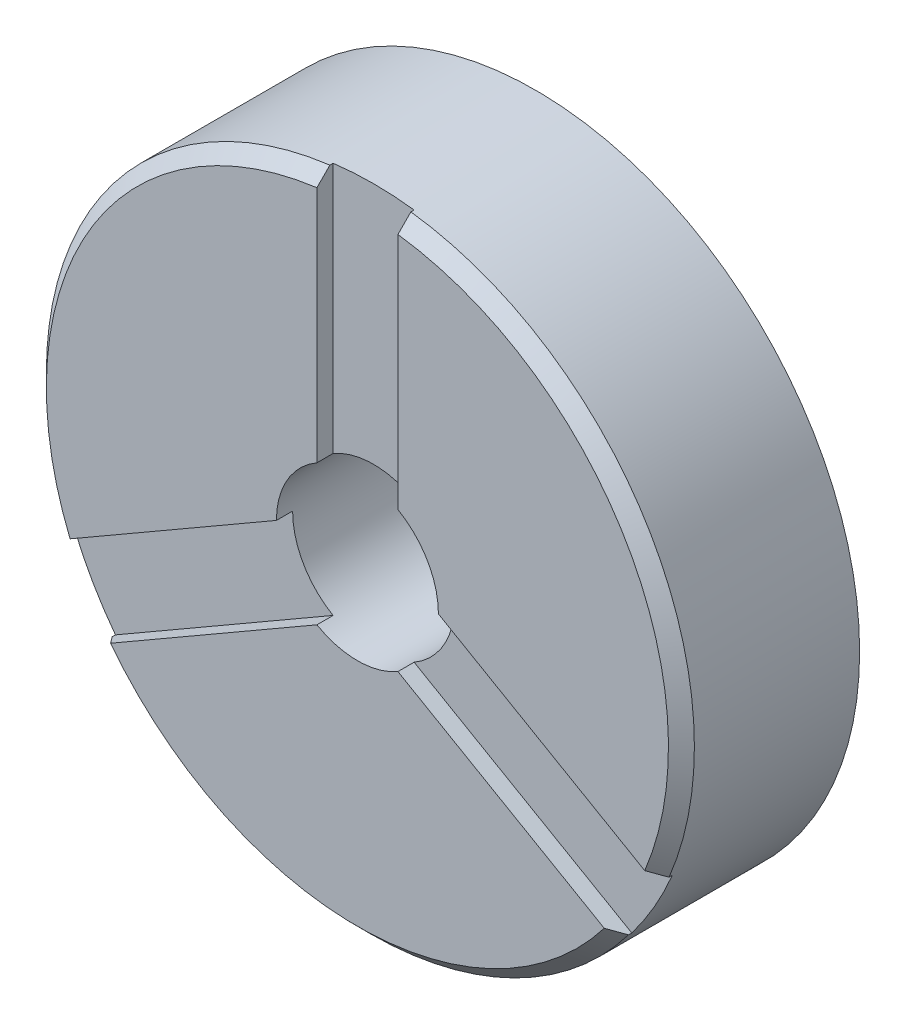
ISO-10303-21;
HEADER;
FILE_DESCRIPTION(('STEP AP214'),'2;1');
FILE_NAME('part.step','',(''),(''),'','','');
FILE_SCHEMA(('AUTOMOTIVE_DESIGN { 1 0 10303 214 1 1 1 1 }'));
ENDSEC;
DATA;
#1=APPLICATION_CONTEXT('core data for automotive mechanical design processes');
#2=APPLICATION_PROTOCOL_DEFINITION('international standard','automotive_design',2000,#1);
#3=PRODUCT_CONTEXT('',#1,'mechanical');
#4=PRODUCT('Part','Part','',(#3));
#5=PRODUCT_RELATED_PRODUCT_CATEGORY('part','',(#4));
#6=PRODUCT_DEFINITION_FORMATION('','',#4);
#7=PRODUCT_DEFINITION_CONTEXT('part definition',#1,'design');
#8=PRODUCT_DEFINITION('design','',#6,#7);
#9=PRODUCT_DEFINITION_SHAPE('','',#8);
#10=(LENGTH_UNIT() NAMED_UNIT(*) SI_UNIT(.MILLI.,.METRE.));
#11=(NAMED_UNIT(*) PLANE_ANGLE_UNIT() SI_UNIT($,.RADIAN.));
#12=(NAMED_UNIT(*) SI_UNIT($,.STERADIAN.) SOLID_ANGLE_UNIT());
#13=UNCERTAINTY_MEASURE_WITH_UNIT(LENGTH_MEASURE(1.E-05),#10,'distance_accuracy_value','');
#14=(GEOMETRIC_REPRESENTATION_CONTEXT(3) GLOBAL_UNCERTAINTY_ASSIGNED_CONTEXT((#13)) GLOBAL_UNIT_ASSIGNED_CONTEXT((#10,
#11,#12)) REPRESENTATION_CONTEXT('',''));
#15=CARTESIAN_POINT('',(0.,0.,0.));
#16=DIRECTION('',(0.,0.,1.));
#17=DIRECTION('',(1.,0.,0.));
#18=AXIS2_PLACEMENT_3D('',#15,#16,#17);
#19=CARTESIAN_POINT('',(0.,0.,0.));
#20=DIRECTION('',(0.,0.,-1.));
#21=DIRECTION('',(0.5,0.866025403784438,0.));
#22=AXIS2_PLACEMENT_3D('',#19,#20,#21);
#23=PLANE('',#22);
#24=DIRECTION('',(0.,-1.,0.));
#25=VECTOR('',#24,1.);
#26=CARTESIAN_POINT('',(-25.,198.431348329844,0.));
#27=LINE('',#26,#25);
#28=CARTESIAN_POINT('',(-25.,198.431348329844,0.));
#29=VERTEX_POINT('',#28);
#30=CARTESIAN_POINT('',(-25.,43.3012701892219,0.));
#31=VERTEX_POINT('',#30);
#32=EDGE_CURVE('E173',#29,#31,#27,.T.);
#33=ORIENTED_EDGE('',*,*,#32,.T.);
#34=CARTESIAN_POINT('',(0.,0.,0.));
#35=DIRECTION('',(0.,0.,1.));
#36=DIRECTION('',(1.,0.,0.));
#37=AXIS2_PLACEMENT_3D('',#34,#35,#36);
#38=CIRCLE('',#37,50.);
#39=CARTESIAN_POINT('',(25.,43.3012701892219,0.));
#40=VERTEX_POINT('',#39);
#41=EDGE_CURVE('E166',#40,#31,#38,.T.);
#42=ORIENTED_EDGE('',*,*,#41,.F.);
#43=DIRECTION('',(0.,1.,0.));
#44=VECTOR('',#43,1.);
#45=CARTESIAN_POINT('',(25.,43.3012701892219,0.));
#46=LINE('',#45,#44);
#47=CARTESIAN_POINT('',(25.,198.431348329844,0.));
#48=VERTEX_POINT('',#47);
#49=EDGE_CURVE('E170',#40,#48,#46,.T.);
#50=ORIENTED_EDGE('',*,*,#49,.T.);
#51=CARTESIAN_POINT('',(0.,0.,0.));
#52=DIRECTION('',(0.,0.,1.));
#53=DIRECTION('',(1.,0.,0.));
#54=AXIS2_PLACEMENT_3D('',#51,#52,#53);
#55=CIRCLE('',#54,200.);
#56=EDGE_CURVE('E198',#48,#29,#55,.T.);
#57=ORIENTED_EDGE('',*,*,#56,.T.);
#58=EDGE_LOOP('',(#33,#42,#50,#57));
#59=FACE_BOUND('',#58,.T.);
#60=ADVANCED_FACE('F17',(#59),#23,.F.);
#61=DIRECTION('',(-0.866025403784438,0.5,0.));
#62=VECTOR('',#61,1.);
#63=CARTESIAN_POINT('',(184.346588560844,-77.5650390703113,0.));
#64=LINE('',#63,#62);
#65=CARTESIAN_POINT('',(184.346588560844,-77.5650390703113,0.));
#66=VERTEX_POINT('',#65);
#67=CARTESIAN_POINT('',(50.,0.,0.));
#68=VERTEX_POINT('',#67);
#69=EDGE_CURVE('E261',#66,#68,#64,.T.);
#70=ORIENTED_EDGE('',*,*,#69,.T.);
#71=CARTESIAN_POINT('',(25.,-43.3012701892219,0.));
#72=VERTEX_POINT('',#71);
#73=EDGE_CURVE('E180',#72,#68,#38,.T.);
#74=ORIENTED_EDGE('',*,*,#73,.F.);
#75=DIRECTION('',(0.866025403784438,-0.5,0.));
#76=VECTOR('',#75,1.);
#77=CARTESIAN_POINT('',(25.,-43.3012701892219,0.));
#78=LINE('',#77,#76);
#79=CARTESIAN_POINT('',(159.346588560844,-120.866309259533,0.));
#80=VERTEX_POINT('',#79);
#81=EDGE_CURVE('E255',#72,#80,#78,.T.);
#82=ORIENTED_EDGE('',*,*,#81,.T.);
#83=CARTESIAN_POINT('',(0.,0.,0.));
#84=DIRECTION('',(0.,0.,1.));
#85=DIRECTION('',(-0.5,-0.866025403784438,0.));
#86=AXIS2_PLACEMENT_3D('',#83,#84,#85);
#87=CIRCLE('',#86,200.);
#88=EDGE_CURVE('E269',#80,#66,#87,.T.);
#89=ORIENTED_EDGE('',*,*,#88,.T.);
#90=EDGE_LOOP('',(#70,#74,#82,#89));
#91=FACE_BOUND('',#90,.T.);
#92=ADVANCED_FACE('F429',(#91),#23,.F.);
#93=CARTESIAN_POINT('',(0.,0.,10.));
#94=DIRECTION('',(0.,0.,1.));
#95=DIRECTION('',(1.,0.,0.));
#96=AXIS2_PLACEMENT_3D('',#93,#94,#95);
#97=PLANE('',#96);
#98=DIRECTION('',(0.866025403784438,-0.5,0.));
#99=VECTOR('',#98,1.);
#100=CARTESIAN_POINT('',(25.,-43.3012701892219,10.));
#101=LINE('',#100,#99);
#102=CARTESIAN_POINT('',(25.,-43.3012701892219,10.));
#103=VERTEX_POINT('',#102);
#104=CARTESIAN_POINT('',(152.361305344826,-116.833354114399,10.));
#105=VERTEX_POINT('',#104);
#106=EDGE_CURVE('E256',#103,#105,#101,.T.);
#107=ORIENTED_EDGE('',*,*,#106,.F.);
#108=CARTESIAN_POINT('',(0.,0.,10.));
#109=DIRECTION('',(0.,0.,1.));
#110=DIRECTION('',(1.,0.,0.));
#111=AXIS2_PLACEMENT_3D('',#108,#109,#110);
#112=CIRCLE('',#111,50.);
#113=CARTESIAN_POINT('',(-25.,-43.3012701892219,10.));
#114=VERTEX_POINT('',#113);
#115=EDGE_CURVE('E206',#114,#103,#112,.T.);
#116=ORIENTED_EDGE('',*,*,#115,.F.);
#117=DIRECTION('',(0.866025403784439,0.5,0.));
#118=VECTOR('',#117,1.);
#119=CARTESIAN_POINT('',(-159.346588560844,-120.866309259533,10.));
#120=LINE('',#119,#118);
#121=CARTESIAN_POINT('',(-152.361305344826,-116.833354114399,10.));
#122=VERTEX_POINT('',#121);
#123=EDGE_CURVE('E226',#122,#114,#120,.T.);
#124=ORIENTED_EDGE('',*,*,#123,.F.);
#125=CARTESIAN_POINT('',(0.,0.,10.));
#126=DIRECTION('',(0.,0.,1.));
#127=DIRECTION('',(1.,0.,0.));
#128=AXIS2_PLACEMENT_3D('',#125,#126,#127);
#129=CIRCLE('',#128,192.);
#130=EDGE_CURVE('E296',#122,#105,#129,.T.);
#131=ORIENTED_EDGE('',*,*,#130,.T.);
#132=EDGE_LOOP('',(#107,#116,#124,#131));
#133=FACE_BOUND('',#132,.T.);
#134=ADVANCED_FACE('F427',(#133),#97,.T.);
#135=DIRECTION('',(-0.866025403784439,-0.5,0.));
#136=VECTOR('',#135,1.);
#137=CARTESIAN_POINT('',(-50.,0.,10.));
#138=LINE('',#137,#136);
#139=CARTESIAN_POINT('',(-50.,0.,10.));
#140=VERTEX_POINT('',#139);
#141=CARTESIAN_POINT('',(-177.361305344826,-73.5320839251774,10.));
#142=VERTEX_POINT('',#141);
#143=EDGE_CURVE('E222',#140,#142,#138,.T.);
#144=ORIENTED_EDGE('',*,*,#143,.F.);
#145=CARTESIAN_POINT('',(-25.,43.3012701892219,10.));
#146=VERTEX_POINT('',#145);
#147=EDGE_CURVE('E204',#146,#140,#112,.T.);
#148=ORIENTED_EDGE('',*,*,#147,.F.);
#149=DIRECTION('',(0.,-1.,0.));
#150=VECTOR('',#149,1.);
#151=CARTESIAN_POINT('',(-25.,198.431348329844,10.));
#152=LINE('',#151,#150);
#153=CARTESIAN_POINT('',(-25.,190.365438039577,10.));
#154=VERTEX_POINT('',#153);
#155=EDGE_CURVE('E208',#154,#146,#152,.T.);
#156=ORIENTED_EDGE('',*,*,#155,.F.);
#157=CARTESIAN_POINT('',(0.,0.,10.));
#158=DIRECTION('',(0.,0.,1.));
#159=DIRECTION('',(1.,0.,0.));
#160=AXIS2_PLACEMENT_3D('',#157,#158,#159);
#161=CIRCLE('',#160,192.);
#162=EDGE_CURVE('E300',#154,#142,#161,.T.);
#163=ORIENTED_EDGE('',*,*,#162,.T.);
#164=EDGE_LOOP('',(#144,#148,#156,#163));
#165=FACE_BOUND('',#164,.T.);
#166=ADVANCED_FACE('F419',(#165),#97,.T.);
#167=DIRECTION('',(0.,1.,0.));
#168=VECTOR('',#167,1.);
#169=CARTESIAN_POINT('',(25.,43.3012701892219,10.));
#170=LINE('',#169,#168);
#171=CARTESIAN_POINT('',(25.,43.3012701892219,10.));
#172=VERTEX_POINT('',#171);
#173=CARTESIAN_POINT('',(25.,190.365438039577,10.));
#174=VERTEX_POINT('',#173);
#175=EDGE_CURVE('E213',#172,#174,#170,.T.);
#176=ORIENTED_EDGE('',*,*,#175,.F.);
#177=CARTESIAN_POINT('',(50.,0.,10.));
#178=VERTEX_POINT('',#177);
#179=EDGE_CURVE('E187',#178,#172,#112,.T.);
#180=ORIENTED_EDGE('',*,*,#179,.F.);
#181=DIRECTION('',(-0.866025403784438,0.5,0.));
#182=VECTOR('',#181,1.);
#183=CARTESIAN_POINT('',(184.346588560844,-77.5650390703113,10.));
#184=LINE('',#183,#182);
#185=CARTESIAN_POINT('',(177.361305344826,-73.5320839251776,10.));
#186=VERTEX_POINT('',#185);
#187=EDGE_CURVE('E260',#186,#178,#184,.T.);
#188=ORIENTED_EDGE('',*,*,#187,.F.);
#189=CARTESIAN_POINT('',(0.,0.,10.));
#190=DIRECTION('',(0.,0.,1.));
#191=DIRECTION('',(1.,0.,0.));
#192=AXIS2_PLACEMENT_3D('',#189,#190,#191);
#193=CIRCLE('',#192,192.);
#194=EDGE_CURVE('E292',#186,#174,#193,.T.);
#195=ORIENTED_EDGE('',*,*,#194,.T.);
#196=EDGE_LOOP('',(#176,#180,#188,#195));
#197=FACE_BOUND('',#196,.T.);
#198=ADVANCED_FACE('F396',(#197),#97,.T.);
#199=CARTESIAN_POINT('',(0.,0.,-100.));
#200=DIRECTION('',(0.,0.,1.));
#201=DIRECTION('',(1.,0.,0.));
#202=AXIS2_PLACEMENT_3D('',#199,#200,#201);
#203=CYLINDRICAL_SURFACE('',#202,200.);
#204=CARTESIAN_POINT('',(0.,0.,-100.));
#205=DIRECTION('',(0.,0.,1.));
#206=DIRECTION('',(1.,0.,0.));
#207=AXIS2_PLACEMENT_3D('',#204,#205,#206);
#208=CIRCLE('',#207,200.);
#209=CARTESIAN_POINT('',(200.,0.,-100.));
#210=VERTEX_POINT('',#209);
#211=EDGE_CURVE('E288',#210,#210,#208,.T.);
#212=ORIENTED_EDGE('',*,*,#211,.T.);
#213=EDGE_LOOP('',(#212));
#214=FACE_BOUND('',#213,.T.);
#215=DIRECTION('',(0.,0.,-1.));
#216=VECTOR('',#215,1.);
#217=CARTESIAN_POINT('',(-184.346588560844,-77.5650390703112,10.));
#218=LINE('',#217,#216);
#219=CARTESIAN_POINT('',(-184.346588560844,-77.5650390703112,2.));
#220=VERTEX_POINT('',#219);
#221=CARTESIAN_POINT('',(-184.346588560844,-77.5650390703112,0.));
#222=VERTEX_POINT('',#221);
#223=EDGE_CURVE('E248',#220,#222,#218,.T.);
#224=ORIENTED_EDGE('',*,*,#223,.F.);
#225=CARTESIAN_POINT('',(0.,0.,2.));
#226=DIRECTION('',(0.,0.,1.));
#227=DIRECTION('',(1.,0.,0.));
#228=AXIS2_PLACEMENT_3D('',#225,#226,#227);
#229=CIRCLE('',#228,200.);
#230=CARTESIAN_POINT('',(-25.,198.431348329844,2.));
#231=VERTEX_POINT('',#230);
#232=EDGE_CURVE('E44',#220,#231,#229,.F.);
#233=ORIENTED_EDGE('',*,*,#232,.T.);
#234=DIRECTION('',(0.,0.,-1.));
#235=VECTOR('',#234,1.);
#236=CARTESIAN_POINT('',(-25.,198.431348329844,10.));
#237=LINE('',#236,#235);
#238=EDGE_CURVE('E217',#231,#29,#237,.T.);
#239=ORIENTED_EDGE('',*,*,#238,.T.);
#240=ORIENTED_EDGE('',*,*,#56,.F.);
#241=DIRECTION('',(0.,0.,-1.));
#242=VECTOR('',#241,1.);
#243=CARTESIAN_POINT('',(25.,198.431348329844,10.));
#244=LINE('',#243,#242);
#245=CARTESIAN_POINT('',(25.,198.431348329844,2.));
#246=VERTEX_POINT('',#245);
#247=EDGE_CURVE('E193',#246,#48,#244,.T.);
#248=ORIENTED_EDGE('',*,*,#247,.F.);
#249=CARTESIAN_POINT('',(0.,0.,2.));
#250=DIRECTION('',(0.,0.,1.));
#251=DIRECTION('',(1.,0.,0.));
#252=AXIS2_PLACEMENT_3D('',#249,#250,#251);
#253=CIRCLE('',#252,200.);
#254=CARTESIAN_POINT('',(184.346588560844,-77.5650390703113,2.00000000000004));
#255=VERTEX_POINT('',#254);
#256=EDGE_CURVE('E313',#246,#255,#253,.F.);
#257=ORIENTED_EDGE('',*,*,#256,.T.);
#258=DIRECTION('',(0.,0.,-1.));
#259=VECTOR('',#258,1.);
#260=CARTESIAN_POINT('',(184.346588560844,-77.5650390703113,10.));
#261=LINE('',#260,#259);
#262=EDGE_CURVE('E279',#255,#66,#261,.T.);
#263=ORIENTED_EDGE('',*,*,#262,.T.);
#264=ORIENTED_EDGE('',*,*,#88,.F.);
#265=DIRECTION('',(0.,0.,-1.));
#266=VECTOR('',#265,1.);
#267=CARTESIAN_POINT('',(159.346588560844,-120.866309259533,10.));
#268=LINE('',#267,#266);
#269=CARTESIAN_POINT('',(159.346588560844,-120.866309259533,2.));
#270=VERTEX_POINT('',#269);
#271=EDGE_CURVE('E282',#270,#80,#268,.T.);
#272=ORIENTED_EDGE('',*,*,#271,.F.);
#273=CARTESIAN_POINT('',(0.,0.,2.));
#274=DIRECTION('',(0.,0.,1.));
#275=DIRECTION('',(1.,0.,0.));
#276=AXIS2_PLACEMENT_3D('',#273,#274,#275);
#277=CIRCLE('',#276,200.);
#278=CARTESIAN_POINT('',(-159.346588560844,-120.866309259533,2.00000000000003));
#279=VERTEX_POINT('',#278);
#280=EDGE_CURVE('E53',#270,#279,#277,.F.);
#281=ORIENTED_EDGE('',*,*,#280,.T.);
#282=DIRECTION('',(0.,0.,-1.));
#283=VECTOR('',#282,1.);
#284=CARTESIAN_POINT('',(-159.346588560844,-120.866309259533,10.));
#285=LINE('',#284,#283);
#286=CARTESIAN_POINT('',(-159.346588560844,-120.866309259533,0.));
#287=VERTEX_POINT('',#286);
#288=EDGE_CURVE('E245',#279,#287,#285,.T.);
#289=ORIENTED_EDGE('',*,*,#288,.T.);
#290=CARTESIAN_POINT('',(0.,0.,0.));
#291=DIRECTION('',(0.,0.,1.));
#292=DIRECTION('',(-0.5,0.866025403784439,0.));
#293=AXIS2_PLACEMENT_3D('',#290,#291,#292);
#294=CIRCLE('',#293,200.);
#295=EDGE_CURVE('E235',#222,#287,#294,.T.);
#296=ORIENTED_EDGE('',*,*,#295,.F.);
#297=EDGE_LOOP('',(#224,#233,#239,#240,#248,#257,#263,#264,#272,#281,#289,#296));
#298=FACE_BOUND('',#297,.T.);
#299=ADVANCED_FACE('F326',(#214,#298),#203,.T.);
#300=CARTESIAN_POINT('',(0.,0.,-100.));
#301=DIRECTION('',(0.,0.,1.));
#302=DIRECTION('',(1.,0.,0.));
#303=AXIS2_PLACEMENT_3D('',#300,#301,#302);
#304=PLANE('',#303);
#305=CARTESIAN_POINT('',(0.,0.,-100.));
#306=DIRECTION('',(0.,0.,1.));
#307=DIRECTION('',(1.,0.,0.));
#308=AXIS2_PLACEMENT_3D('',#305,#306,#307);
#309=CIRCLE('',#308,50.);
#310=CARTESIAN_POINT('',(50.,0.,-100.));
#311=VERTEX_POINT('',#310);
#312=EDGE_CURVE('E177',#311,#311,#309,.T.);
#313=ORIENTED_EDGE('',*,*,#312,.T.);
#314=EDGE_LOOP('',(#313));
#315=FACE_BOUND('',#314,.T.);
#316=ORIENTED_EDGE('',*,*,#211,.F.);
#317=EDGE_LOOP('',(#316));
#318=FACE_BOUND('',#317,.T.);
#319=ADVANCED_FACE('F449',(#315,#318),#304,.F.);
#320=CARTESIAN_POINT('',(25.,-43.3012701892219,10.));
#321=DIRECTION('',(0.5,0.866025403784438,0.));
#322=DIRECTION('',(-0.866025403784438,0.5,0.));
#323=AXIS2_PLACEMENT_3D('',#320,#321,#322);
#324=PLANE('',#323);
#325=ORIENTED_EDGE('',*,*,#106,.T.);
#326=CARTESIAN_POINT('',(152.361305344826,-116.833354114399,10.));
#327=CARTESIAN_POINT('',(153.525714157162,-117.505625855649,8.66689362161998));
#328=CARTESIAN_POINT('',(154.690025498083,-118.17784132175,7.33367376566634));
#329=CARTESIAN_POINT('',(157.018453236756,-119.522159703461,4.66700709899961));
#330=CARTESIAN_POINT('',(158.182569634508,-120.194262619071,3.33356028828658));
#331=CARTESIAN_POINT('',(159.346588560844,-120.866309259533,2.));
#332=B_SPLINE_CURVE_WITH_KNOTS('',3,(#326,#327,#328,#329,#330,#331),.UNSPECIFIED.,.F.,.F.,(4,2,
4),(0.,5.68020487675816,11.3604097518643),.UNSPECIFIED.);
#333=EDGE_CURVE('E340',#105,#270,#332,.T.);
#334=ORIENTED_EDGE('',*,*,#333,.T.);
#335=ORIENTED_EDGE('',*,*,#271,.T.);
#336=ORIENTED_EDGE('',*,*,#81,.F.);
#337=DIRECTION('',(0.,0.,-1.));
#338=VECTOR('',#337,1.);
#339=CARTESIAN_POINT('',(25.,-43.3012701892219,10.));
#340=LINE('',#339,#338);
#341=EDGE_CURVE('E285',#103,#72,#340,.T.);
#342=ORIENTED_EDGE('',*,*,#341,.F.);
#343=EDGE_LOOP('',(#325,#334,#335,#336,#342));
#344=FACE_BOUND('',#343,.T.);
#345=ADVANCED_FACE('F374',(#344),#324,.T.);
#346=CARTESIAN_POINT('',(184.346588560844,-77.5650390703113,10.));
#347=DIRECTION('',(-0.5,-0.866025403784438,0.));
#348=DIRECTION('',(0.866025403784438,-0.5,0.));
#349=AXIS2_PLACEMENT_3D('',#346,#347,#348);
#350=PLANE('',#349);
#351=ORIENTED_EDGE('',*,*,#262,.F.);
#352=CARTESIAN_POINT('',(184.346588560844,-77.5650390703113,2.));
#353=CARTESIAN_POINT('',(183.182569634508,-76.8929924298491,3.33356028828658));
#354=CARTESIAN_POINT('',(182.018453236756,-76.2208895142391,4.66700709899961));
#355=CARTESIAN_POINT('',(179.690025498083,-74.876571132528,7.33367376566635));
#356=CARTESIAN_POINT('',(178.525714157162,-74.2043556664267,8.66689362161998));
#357=CARTESIAN_POINT('',(177.361305344826,-73.5320839251776,10.));
#358=B_SPLINE_CURVE_WITH_KNOTS('',3,(#352,#353,#354,#355,#356,#357),.UNSPECIFIED.,.F.,.F.,(4,2,
4),(0.,5.68020487510614,11.3604097518643),.UNSPECIFIED.);
#359=EDGE_CURVE('E11',#255,#186,#358,.T.);
#360=ORIENTED_EDGE('',*,*,#359,.T.);
#361=ORIENTED_EDGE('',*,*,#187,.T.);
#362=DIRECTION('',(0.,0.,-1.));
#363=VECTOR('',#362,1.);
#364=CARTESIAN_POINT('',(50.,0.,10.));
#365=LINE('',#364,#363);
#366=EDGE_CURVE('E265',#178,#68,#365,.T.);
#367=ORIENTED_EDGE('',*,*,#366,.T.);
#368=ORIENTED_EDGE('',*,*,#69,.F.);
#369=EDGE_LOOP('',(#351,#360,#361,#367,#368));
#370=FACE_BOUND('',#369,.T.);
#371=ADVANCED_FACE('F392',(#370),#350,.T.);
#372=DIRECTION('',(0.866025403784439,0.5,0.));
#373=VECTOR('',#372,1.);
#374=CARTESIAN_POINT('',(-159.346588560844,-120.866309259533,0.));
#375=LINE('',#374,#373);
#376=CARTESIAN_POINT('',(-25.,-43.3012701892219,0.));
#377=VERTEX_POINT('',#376);
#378=EDGE_CURVE('E227',#287,#377,#375,.T.);
#379=ORIENTED_EDGE('',*,*,#378,.T.);
#380=CARTESIAN_POINT('',(-50.,0.,0.));
#381=VERTEX_POINT('',#380);
#382=EDGE_CURVE('E178',#381,#377,#38,.T.);
#383=ORIENTED_EDGE('',*,*,#382,.F.);
#384=DIRECTION('',(-0.866025403784439,-0.5,0.));
#385=VECTOR('',#384,1.);
#386=CARTESIAN_POINT('',(-50.,0.,0.));
#387=LINE('',#386,#385);
#388=EDGE_CURVE('E192',#381,#222,#387,.T.);
#389=ORIENTED_EDGE('',*,*,#388,.T.);
#390=ORIENTED_EDGE('',*,*,#295,.T.);
#391=EDGE_LOOP('',(#379,#383,#389,#390));
#392=FACE_BOUND('',#391,.T.);
#393=ADVANCED_FACE('F425',(#392),#23,.F.);
#394=CARTESIAN_POINT('',(-50.,0.,10.));
#395=DIRECTION('',(0.5,-0.866025403784439,0.));
#396=DIRECTION('',(0.866025403784439,0.5,0.));
#397=AXIS2_PLACEMENT_3D('',#394,#395,#396);
#398=PLANE('',#397);
#399=ORIENTED_EDGE('',*,*,#143,.T.);
#400=CARTESIAN_POINT('',(-177.361305344826,-73.5320839251774,10.));
#401=CARTESIAN_POINT('',(-178.525714157162,-74.2043556664266,8.66689362162001));
#402=CARTESIAN_POINT('',(-179.690025498083,-74.8765711325278,7.33367376566638));
#403=CARTESIAN_POINT('',(-182.018453236756,-76.220889514239,4.66700709899965));
#404=CARTESIAN_POINT('',(-183.182569634508,-76.892992429849,3.33356028828661));
#405=CARTESIAN_POINT('',(-184.346588560844,-77.5650390703111,2.));
#406=B_SPLINE_CURVE_WITH_KNOTS('',3,(#400,#401,#402,#403,#404,#405),.UNSPECIFIED.,.F.,.F.,(4,2,
4),(0.,5.68020487675815,11.3604097518643),.UNSPECIFIED.);
#407=EDGE_CURVE('E304',#142,#220,#406,.T.);
#408=ORIENTED_EDGE('',*,*,#407,.T.);
#409=ORIENTED_EDGE('',*,*,#223,.T.);
#410=ORIENTED_EDGE('',*,*,#388,.F.);
#411=DIRECTION('',(0.,0.,-1.));
#412=VECTOR('',#411,1.);
#413=CARTESIAN_POINT('',(-50.,0.,10.));
#414=LINE('',#413,#412);
#415=EDGE_CURVE('E251',#140,#381,#414,.T.);
#416=ORIENTED_EDGE('',*,*,#415,.F.);
#417=EDGE_LOOP('',(#399,#408,#409,#410,#416));
#418=FACE_BOUND('',#417,.T.);
#419=ADVANCED_FACE('F315',(#418),#398,.T.);
#420=CARTESIAN_POINT('',(-159.346588560844,-120.866309259533,10.));
#421=DIRECTION('',(-0.5,0.866025403784439,0.));
#422=DIRECTION('',(-0.866025403784439,-0.5,0.));
#423=AXIS2_PLACEMENT_3D('',#420,#421,#422);
#424=PLANE('',#423);
#425=ORIENTED_EDGE('',*,*,#288,.F.);
#426=CARTESIAN_POINT('',(-159.346588560844,-120.866309259533,2.));
#427=CARTESIAN_POINT('',(-158.182569634508,-120.194262619071,3.3335602882866));
#428=CARTESIAN_POINT('',(-157.018453236756,-119.522159703461,4.66700709899964));
#429=CARTESIAN_POINT('',(-154.690025498083,-118.17784132175,7.33367376566637));
#430=CARTESIAN_POINT('',(-153.525714157162,-117.505625855648,8.66689362162));
#431=CARTESIAN_POINT('',(-152.361305344826,-116.833354114399,10.));
#432=B_SPLINE_CURVE_WITH_KNOTS('',3,(#426,#427,#428,#429,#430,#431),.UNSPECIFIED.,.F.,.F.,(4,2,
4),(0.,5.68020487510612,11.3604097518643),.UNSPECIFIED.);
#433=EDGE_CURVE('E361',#279,#122,#432,.T.);
#434=ORIENTED_EDGE('',*,*,#433,.T.);
#435=ORIENTED_EDGE('',*,*,#123,.T.);
#436=DIRECTION('',(0.,0.,-1.));
#437=VECTOR('',#436,1.);
#438=CARTESIAN_POINT('',(-25.,-43.3012701892219,10.));
#439=LINE('',#438,#437);
#440=EDGE_CURVE('E231',#114,#377,#439,.T.);
#441=ORIENTED_EDGE('',*,*,#440,.T.);
#442=ORIENTED_EDGE('',*,*,#378,.F.);
#443=EDGE_LOOP('',(#425,#434,#435,#441,#442));
#444=FACE_BOUND('',#443,.T.);
#445=ADVANCED_FACE('F354',(#444),#424,.T.);
#446=CARTESIAN_POINT('',(25.,43.3012701892219,10.));
#447=DIRECTION('',(-1.,0.,0.));
#448=DIRECTION('',(0.,-1.,0.));
#449=AXIS2_PLACEMENT_3D('',#446,#447,#448);
#450=PLANE('',#449);
#451=ORIENTED_EDGE('',*,*,#175,.T.);
#452=CARTESIAN_POINT('',(25.,190.365438039577,10.));
#453=CARTESIAN_POINT('',(25.,191.709981522075,8.66689362161992));
#454=CARTESIAN_POINT('',(25.,193.054412454278,7.33367376566625));
#455=CARTESIAN_POINT('',(25.,195.7430492177,4.66700709899952));
#456=CARTESIAN_POINT('',(25.,197.08725504892,3.33356028828652));
#457=CARTESIAN_POINT('',(25.,198.431348329844,2.));
#458=B_SPLINE_CURVE_WITH_KNOTS('',3,(#452,#453,#454,#455,#456,#457),.UNSPECIFIED.,.F.,.F.,(4,2,
4),(0.,5.68020487675816,11.3604097518643),.UNSPECIFIED.);
#459=EDGE_CURVE('E32',#174,#246,#458,.T.);
#460=ORIENTED_EDGE('',*,*,#459,.T.);
#461=ORIENTED_EDGE('',*,*,#247,.T.);
#462=ORIENTED_EDGE('',*,*,#49,.F.);
#463=DIRECTION('',(0.,0.,-1.));
#464=VECTOR('',#463,1.);
#465=CARTESIAN_POINT('',(25.,43.3012701892219,10.));
#466=LINE('',#465,#464);
#467=EDGE_CURVE('E182',#172,#40,#466,.T.);
#468=ORIENTED_EDGE('',*,*,#467,.F.);
#469=EDGE_LOOP('',(#451,#460,#461,#462,#468));
#470=FACE_BOUND('',#469,.T.);
#471=ADVANCED_FACE('F195',(#470),#450,.T.);
#472=CARTESIAN_POINT('',(-25.,198.431348329844,10.));
#473=DIRECTION('',(1.,0.,0.));
#474=DIRECTION('',(0.,1.,0.));
#475=AXIS2_PLACEMENT_3D('',#472,#473,#474);
#476=PLANE('',#475);
#477=ORIENTED_EDGE('',*,*,#238,.F.);
#478=CARTESIAN_POINT('',(-25.,198.431348329844,2.));
#479=CARTESIAN_POINT('',(-25.,197.08725504892,3.33356028828652));
#480=CARTESIAN_POINT('',(-25.,195.7430492177,4.66700709899951));
#481=CARTESIAN_POINT('',(-25.,193.054412454278,7.33367376566625));
#482=CARTESIAN_POINT('',(-25.,191.709981522075,8.66689362161992));
#483=CARTESIAN_POINT('',(-25.,190.365438039577,10.));
#484=B_SPLINE_CURVE_WITH_KNOTS('',3,(#478,#479,#480,#481,#482,#483),.UNSPECIFIED.,.F.,.F.,(4,2,
4),(0.,5.68020487510613,11.3604097518643),.UNSPECIFIED.);
#485=EDGE_CURVE('E331',#231,#154,#484,.T.);
#486=ORIENTED_EDGE('',*,*,#485,.T.);
#487=ORIENTED_EDGE('',*,*,#155,.T.);
#488=DIRECTION('',(0.,0.,-1.));
#489=VECTOR('',#488,1.);
#490=CARTESIAN_POINT('',(-25.,43.3012701892219,10.));
#491=LINE('',#490,#489);
#492=EDGE_CURVE('E214',#146,#31,#491,.T.);
#493=ORIENTED_EDGE('',*,*,#492,.T.);
#494=ORIENTED_EDGE('',*,*,#32,.F.);
#495=EDGE_LOOP('',(#477,#486,#487,#493,#494));
#496=FACE_BOUND('',#495,.T.);
#497=ADVANCED_FACE('F324',(#496),#476,.T.);
#498=CARTESIAN_POINT('',(0.,0.,10.));
#499=DIRECTION('',(0.,0.,-1.));
#500=DIRECTION('',(-1.,0.,0.));
#501=AXIS2_PLACEMENT_3D('',#498,#499,#500);
#502=CONICAL_SURFACE('',#501,192.,0.785398163397449);
#503=ORIENTED_EDGE('',*,*,#485,.F.);
#504=ORIENTED_EDGE('',*,*,#232,.F.);
#505=ORIENTED_EDGE('',*,*,#407,.F.);
#506=ORIENTED_EDGE('',*,*,#162,.F.);
#507=EDGE_LOOP('',(#503,#504,#505,#506));
#508=FACE_BOUND('',#507,.T.);
#509=ADVANCED_FACE('F319',(#508),#502,.T.);
#510=CARTESIAN_POINT('',(0.,0.,10.));
#511=DIRECTION('',(0.,0.,-1.));
#512=DIRECTION('',(-1.,0.,0.));
#513=AXIS2_PLACEMENT_3D('',#510,#511,#512);
#514=CONICAL_SURFACE('',#513,192.,0.785398163397449);
#515=ORIENTED_EDGE('',*,*,#433,.F.);
#516=ORIENTED_EDGE('',*,*,#280,.F.);
#517=ORIENTED_EDGE('',*,*,#333,.F.);
#518=ORIENTED_EDGE('',*,*,#130,.F.);
#519=EDGE_LOOP('',(#515,#516,#517,#518));
#520=FACE_BOUND('',#519,.T.);
#521=ADVANCED_FACE('F323',(#520),#514,.T.);
#522=CARTESIAN_POINT('',(0.,0.,10.));
#523=DIRECTION('',(0.,0.,-1.));
#524=DIRECTION('',(-1.,0.,0.));
#525=AXIS2_PLACEMENT_3D('',#522,#523,#524);
#526=CONICAL_SURFACE('',#525,192.,0.78539816339745);
#527=ORIENTED_EDGE('',*,*,#359,.F.);
#528=ORIENTED_EDGE('',*,*,#256,.F.);
#529=ORIENTED_EDGE('',*,*,#459,.F.);
#530=ORIENTED_EDGE('',*,*,#194,.F.);
#531=EDGE_LOOP('',(#527,#528,#529,#530));
#532=FACE_BOUND('',#531,.T.);
#533=ADVANCED_FACE('F19',(#532),#526,.T.);
#534=CARTESIAN_POINT('',(0.,0.,10.));
#535=DIRECTION('',(0.,0.,-1.));
#536=DIRECTION('',(-1.,0.,0.));
#537=AXIS2_PLACEMENT_3D('',#534,#535,#536);
#538=CYLINDRICAL_SURFACE('',#537,50.);
#539=ORIENTED_EDGE('',*,*,#341,.T.);
#540=ORIENTED_EDGE('',*,*,#73,.T.);
#541=ORIENTED_EDGE('',*,*,#366,.F.);
#542=ORIENTED_EDGE('',*,*,#179,.T.);
#543=ORIENTED_EDGE('',*,*,#467,.T.);
#544=ORIENTED_EDGE('',*,*,#41,.T.);
#545=ORIENTED_EDGE('',*,*,#492,.F.);
#546=ORIENTED_EDGE('',*,*,#147,.T.);
#547=ORIENTED_EDGE('',*,*,#415,.T.);
#548=ORIENTED_EDGE('',*,*,#382,.T.);
#549=ORIENTED_EDGE('',*,*,#440,.F.);
#550=ORIENTED_EDGE('',*,*,#115,.T.);
#551=EDGE_LOOP('',(#539,#540,#541,#542,#543,#544,#545,#546,#547,#548,#549,#550));
#552=FACE_BOUND('',#551,.T.);
#553=ORIENTED_EDGE('',*,*,#312,.F.);
#554=EDGE_LOOP('',(#553));
#555=FACE_BOUND('',#554,.T.);
#556=ADVANCED_FACE('F184',(#552,#555),#538,.F.);
#557=CLOSED_SHELL('',(#60,#92,#134,#166,#198,#299,#319,#345,#371,#393,#419,#445,#471,#497,#509,
#521,#533,#556));
#558=MANIFOLD_SOLID_BREP('B1',#557);
#559=ADVANCED_BREP_SHAPE_REPRESENTATION('',(#18,#558),#14);
#560=SHAPE_DEFINITION_REPRESENTATION(#9,#559);
ENDSEC;
END-ISO-10303-21;
